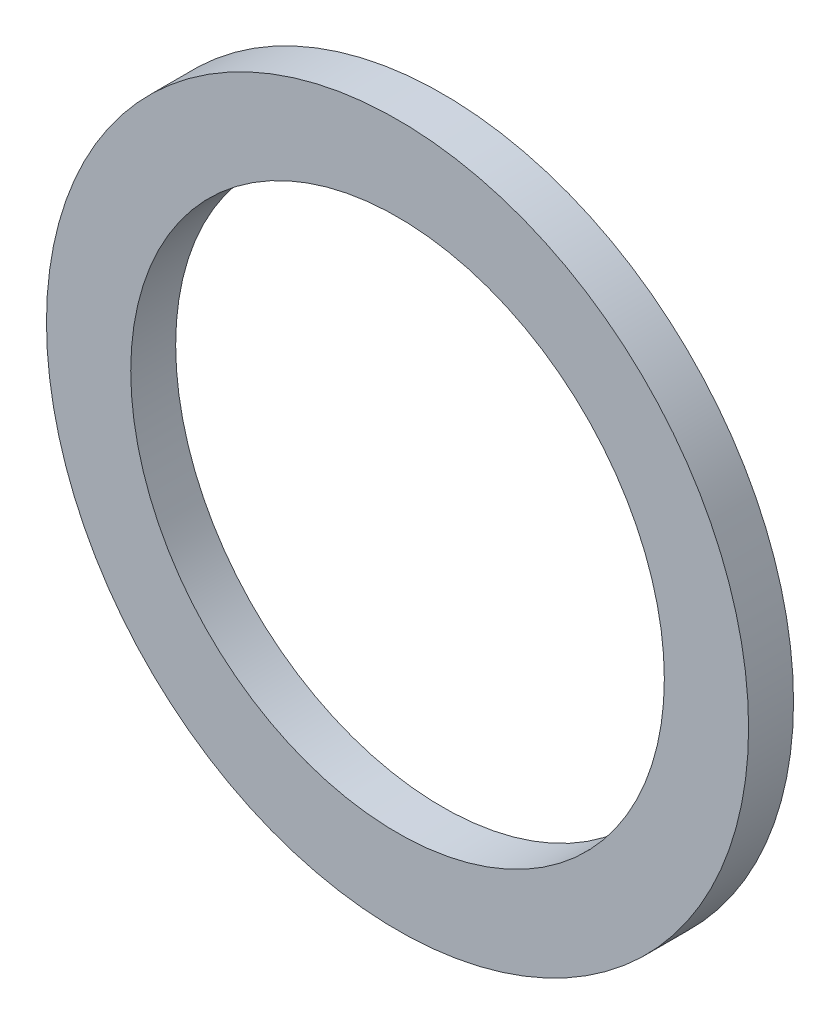
ISO-10303-21;
HEADER;
FILE_DESCRIPTION(('STEP AP214'),'2;1');
FILE_NAME('part.step','',(''),(''),'','','');
FILE_SCHEMA(('AUTOMOTIVE_DESIGN { 1 0 10303 214 1 1 1 1 }'));
ENDSEC;
DATA;
#1=APPLICATION_CONTEXT('core data for automotive mechanical design processes');
#2=APPLICATION_PROTOCOL_DEFINITION('international standard','automotive_design',2000,#1);
#3=PRODUCT_CONTEXT('',#1,'mechanical');
#4=PRODUCT('Part','Part','',(#3));
#5=PRODUCT_RELATED_PRODUCT_CATEGORY('part','',(#4));
#6=PRODUCT_DEFINITION_FORMATION('','',#4);
#7=PRODUCT_DEFINITION_CONTEXT('part definition',#1,'design');
#8=PRODUCT_DEFINITION('design','',#6,#7);
#9=PRODUCT_DEFINITION_SHAPE('','',#8);
#10=(LENGTH_UNIT() NAMED_UNIT(*) SI_UNIT(.MILLI.,.METRE.));
#11=(NAMED_UNIT(*) PLANE_ANGLE_UNIT() SI_UNIT($,.RADIAN.));
#12=(NAMED_UNIT(*) SI_UNIT($,.STERADIAN.) SOLID_ANGLE_UNIT());
#13=UNCERTAINTY_MEASURE_WITH_UNIT(LENGTH_MEASURE(1.E-05),#10,'distance_accuracy_value','');
#14=(GEOMETRIC_REPRESENTATION_CONTEXT(3) GLOBAL_UNCERTAINTY_ASSIGNED_CONTEXT((#13)) GLOBAL_UNIT_ASSIGNED_CONTEXT((#10,
#11,#12)) REPRESENTATION_CONTEXT('',''));
#15=CARTESIAN_POINT('',(0.,0.,0.));
#16=DIRECTION('',(0.,0.,1.));
#17=DIRECTION('',(1.,0.,0.));
#18=AXIS2_PLACEMENT_3D('',#15,#16,#17);
#19=CARTESIAN_POINT('',(0.,0.,0.4064));
#20=DIRECTION('',(0.,0.,1.));
#21=DIRECTION('',(1.,0.,0.));
#22=AXIS2_PLACEMENT_3D('',#19,#20,#21);
#23=PLANE('',#22);
#24=CARTESIAN_POINT('',(0.,0.,0.4064));
#25=DIRECTION('',(0.,0.,1.));
#26=DIRECTION('',(1.,0.,0.));
#27=AXIS2_PLACEMENT_3D('',#24,#25,#26);
#28=CIRCLE('',#27,3.175);
#29=CARTESIAN_POINT('',(3.175,0.,0.4064));
#30=VERTEX_POINT('',#29);
#31=EDGE_CURVE('E10',#30,#30,#28,.T.);
#32=ORIENTED_EDGE('',*,*,#31,.T.);
#33=EDGE_LOOP('',(#32));
#34=FACE_BOUND('',#33,.T.);
#35=CARTESIAN_POINT('',(0.,0.,0.4064));
#36=DIRECTION('',(0.,0.,1.));
#37=DIRECTION('',(1.,0.,0.));
#38=AXIS2_PLACEMENT_3D('',#35,#36,#37);
#39=CIRCLE('',#38,2.413);
#40=CARTESIAN_POINT('',(2.413,0.,0.4064));
#41=VERTEX_POINT('',#40);
#42=EDGE_CURVE('E41',#41,#41,#39,.T.);
#43=ORIENTED_EDGE('',*,*,#42,.F.);
#44=EDGE_LOOP('',(#43));
#45=FACE_BOUND('',#44,.T.);
#46=ADVANCED_FACE('F30',(#34,#45),#23,.T.);
#47=CARTESIAN_POINT('',(0.,0.,0.));
#48=DIRECTION('',(0.,0.,1.));
#49=DIRECTION('',(1.,0.,0.));
#50=AXIS2_PLACEMENT_3D('',#47,#48,#49);
#51=PLANE('',#50);
#52=CARTESIAN_POINT('',(0.,0.,0.));
#53=DIRECTION('',(0.,0.,1.));
#54=DIRECTION('',(1.,0.,0.));
#55=AXIS2_PLACEMENT_3D('',#52,#53,#54);
#56=CIRCLE('',#55,3.175);
#57=CARTESIAN_POINT('',(3.175,0.,0.));
#58=VERTEX_POINT('',#57);
#59=EDGE_CURVE('E34',#58,#58,#56,.T.);
#60=ORIENTED_EDGE('',*,*,#59,.F.);
#61=EDGE_LOOP('',(#60));
#62=FACE_BOUND('',#61,.T.);
#63=CARTESIAN_POINT('',(0.,0.,0.));
#64=DIRECTION('',(0.,0.,1.));
#65=DIRECTION('',(1.,0.,0.));
#66=AXIS2_PLACEMENT_3D('',#63,#64,#65);
#67=CIRCLE('',#66,2.413);
#68=CARTESIAN_POINT('',(2.413,0.,0.));
#69=VERTEX_POINT('',#68);
#70=EDGE_CURVE('E43',#69,#69,#67,.T.);
#71=ORIENTED_EDGE('',*,*,#70,.T.);
#72=EDGE_LOOP('',(#71));
#73=FACE_BOUND('',#72,.T.);
#74=ADVANCED_FACE('F53',(#62,#73),#51,.F.);
#75=CARTESIAN_POINT('',(0.,0.,0.4064));
#76=DIRECTION('',(0.,0.,-1.));
#77=DIRECTION('',(-1.,0.,0.));
#78=AXIS2_PLACEMENT_3D('',#75,#76,#77);
#79=CYLINDRICAL_SURFACE('',#78,3.175);
#80=ORIENTED_EDGE('',*,*,#31,.F.);
#81=EDGE_LOOP('',(#80));
#82=FACE_BOUND('',#81,.T.);
#83=ORIENTED_EDGE('',*,*,#59,.T.);
#84=EDGE_LOOP('',(#83));
#85=FACE_BOUND('',#84,.T.);
#86=ADVANCED_FACE('F32',(#82,#85),#79,.T.);
#87=CARTESIAN_POINT('',(0.,0.,0.4064));
#88=DIRECTION('',(0.,0.,-1.));
#89=DIRECTION('',(-1.,0.,0.));
#90=AXIS2_PLACEMENT_3D('',#87,#88,#89);
#91=CYLINDRICAL_SURFACE('',#90,2.413);
#92=ORIENTED_EDGE('',*,*,#42,.T.);
#93=EDGE_LOOP('',(#92));
#94=FACE_BOUND('',#93,.T.);
#95=ORIENTED_EDGE('',*,*,#70,.F.);
#96=EDGE_LOOP('',(#95));
#97=FACE_BOUND('',#96,.T.);
#98=ADVANCED_FACE('F49',(#94,#97),#91,.F.);
#99=CLOSED_SHELL('',(#46,#74,#86,#98));
#100=MANIFOLD_SOLID_BREP('B2',#99);
#101=ADVANCED_BREP_SHAPE_REPRESENTATION('',(#18,#100),#14);
#102=SHAPE_DEFINITION_REPRESENTATION(#9,#101);
ENDSEC;
END-ISO-10303-21;
